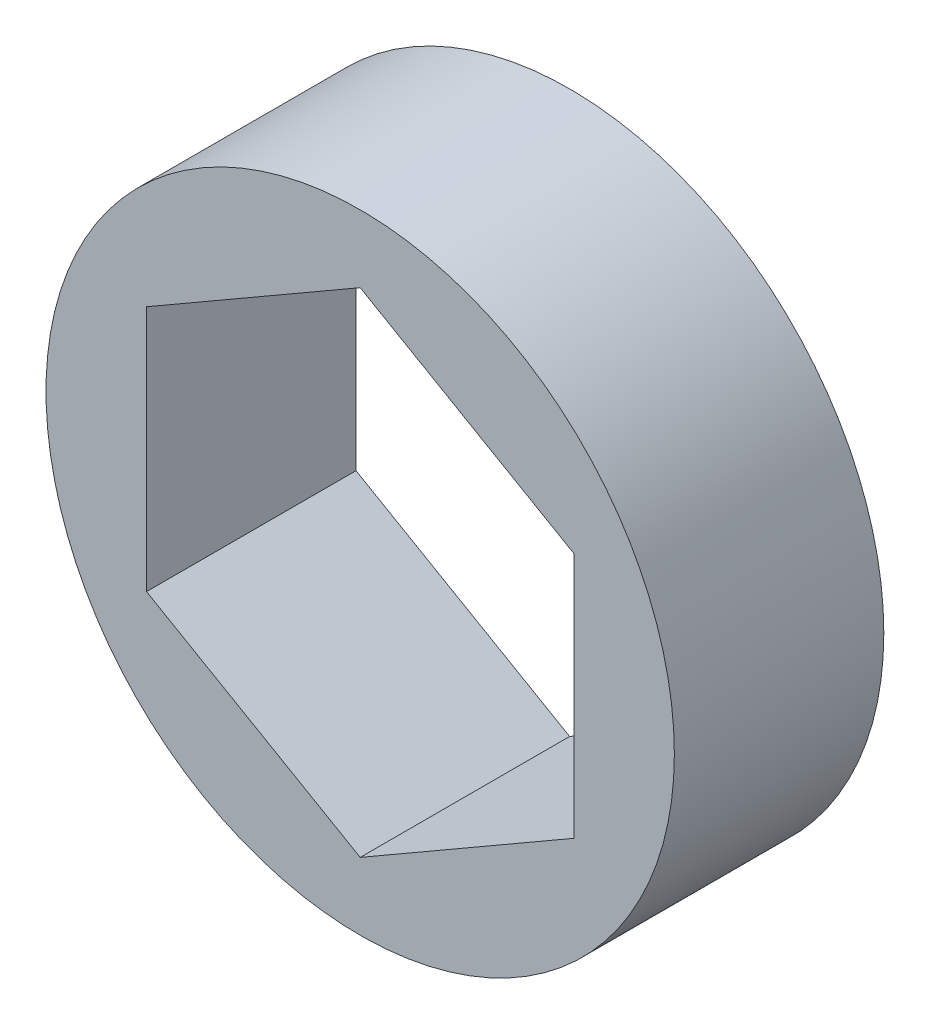
ISO-10303-21;
HEADER;
FILE_DESCRIPTION(('STEP AP214'),'2;1');
FILE_NAME('part.step','',(''),(''),'','','');
FILE_SCHEMA(('AUTOMOTIVE_DESIGN { 1 0 10303 214 1 1 1 1 }'));
ENDSEC;
DATA;
#1=APPLICATION_CONTEXT('core data for automotive mechanical design processes');
#2=APPLICATION_PROTOCOL_DEFINITION('international standard','automotive_design',2000,#1);
#3=PRODUCT_CONTEXT('',#1,'mechanical');
#4=PRODUCT('Part','Part','',(#3));
#5=PRODUCT_RELATED_PRODUCT_CATEGORY('part','',(#4));
#6=PRODUCT_DEFINITION_FORMATION('','',#4);
#7=PRODUCT_DEFINITION_CONTEXT('part definition',#1,'design');
#8=PRODUCT_DEFINITION('design','',#6,#7);
#9=PRODUCT_DEFINITION_SHAPE('','',#8);
#10=(LENGTH_UNIT() NAMED_UNIT(*) SI_UNIT(.MILLI.,.METRE.));
#11=(NAMED_UNIT(*) PLANE_ANGLE_UNIT() SI_UNIT($,.RADIAN.));
#12=(NAMED_UNIT(*) SI_UNIT($,.STERADIAN.) SOLID_ANGLE_UNIT());
#13=UNCERTAINTY_MEASURE_WITH_UNIT(LENGTH_MEASURE(1.E-05),#10,'distance_accuracy_value','');
#14=(GEOMETRIC_REPRESENTATION_CONTEXT(3) GLOBAL_UNCERTAINTY_ASSIGNED_CONTEXT((#13)) GLOBAL_UNIT_ASSIGNED_CONTEXT((#10,
#11,#12)) REPRESENTATION_CONTEXT('',''));
#15=CARTESIAN_POINT('',(0.,0.,0.));
#16=DIRECTION('',(0.,0.,1.));
#17=DIRECTION('',(1.,0.,0.));
#18=AXIS2_PLACEMENT_3D('',#15,#16,#17);
#19=CARTESIAN_POINT('',(0.,0.,3.175));
#20=DIRECTION('',(0.,0.,1.));
#21=DIRECTION('',(1.,0.,0.));
#22=AXIS2_PLACEMENT_3D('',#19,#20,#21);
#23=PLANE('',#22);
#24=CARTESIAN_POINT('',(0.,0.,3.175));
#25=DIRECTION('',(0.,0.,1.));
#26=DIRECTION('',(1.,0.,0.));
#27=AXIS2_PLACEMENT_3D('',#24,#25,#26);
#28=CIRCLE('',#27,9.525);
#29=CARTESIAN_POINT('',(9.525,0.,3.175));
#30=VERTEX_POINT('',#29);
#31=EDGE_CURVE('E11',#30,#30,#28,.T.);
#32=ORIENTED_EDGE('',*,*,#31,.T.);
#33=EDGE_LOOP('',(#32));
#34=FACE_BOUND('',#33,.T.);
#35=DIRECTION('',(-0.866025403784439,-0.5,0.));
#36=VECTOR('',#35,1.);
#37=CARTESIAN_POINT('',(0.,7.47899538708241,3.175));
#38=LINE('',#37,#36);
#39=CARTESIAN_POINT('',(0.,7.47899538708241,3.175));
#40=VERTEX_POINT('',#39);
#41=CARTESIAN_POINT('',(-6.477,3.73949769354121,3.175));
#42=VERTEX_POINT('',#41);
#43=EDGE_CURVE('E108',#40,#42,#38,.T.);
#44=ORIENTED_EDGE('',*,*,#43,.F.);
#45=DIRECTION('',(-0.866025403784439,0.5,0.));
#46=VECTOR('',#45,1.);
#47=CARTESIAN_POINT('',(6.477,3.73949769354121,3.175));
#48=LINE('',#47,#46);
#49=CARTESIAN_POINT('',(6.477,3.73949769354121,3.175));
#50=VERTEX_POINT('',#49);
#51=EDGE_CURVE('E99',#50,#40,#48,.T.);
#52=ORIENTED_EDGE('',*,*,#51,.F.);
#53=DIRECTION('',(0.,1.,0.));
#54=VECTOR('',#53,1.);
#55=CARTESIAN_POINT('',(6.477,-3.73949769354121,3.175));
#56=LINE('',#55,#54);
#57=CARTESIAN_POINT('',(6.477,-3.73949769354121,3.175));
#58=VERTEX_POINT('',#57);
#59=EDGE_CURVE('E133',#58,#50,#56,.T.);
#60=ORIENTED_EDGE('',*,*,#59,.F.);
#61=DIRECTION('',(0.866025403784439,0.5,0.));
#62=VECTOR('',#61,1.);
#63=CARTESIAN_POINT('',(0.,-7.47899538708241,3.175));
#64=LINE('',#63,#62);
#65=CARTESIAN_POINT('',(0.,-7.47899538708241,3.175));
#66=VERTEX_POINT('',#65);
#67=EDGE_CURVE('E130',#66,#58,#64,.T.);
#68=ORIENTED_EDGE('',*,*,#67,.F.);
#69=DIRECTION('',(0.866025403784439,-0.5,0.));
#70=VECTOR('',#69,1.);
#71=CARTESIAN_POINT('',(-6.477,-3.73949769354121,3.175));
#72=LINE('',#71,#70);
#73=CARTESIAN_POINT('',(-6.477,-3.73949769354121,3.175));
#74=VERTEX_POINT('',#73);
#75=EDGE_CURVE('E125',#74,#66,#72,.T.);
#76=ORIENTED_EDGE('',*,*,#75,.F.);
#77=DIRECTION('',(0.,-1.,0.));
#78=VECTOR('',#77,1.);
#79=CARTESIAN_POINT('',(-6.477,3.73949769354121,3.175));
#80=LINE('',#79,#78);
#81=EDGE_CURVE('E121',#42,#74,#80,.T.);
#82=ORIENTED_EDGE('',*,*,#81,.F.);
#83=EDGE_LOOP('',(#44,#52,#60,#68,#76,#82));
#84=FACE_BOUND('',#83,.T.);
#85=ADVANCED_FACE('F45',(#34,#84),#23,.T.);
#86=CARTESIAN_POINT('',(0.,0.,-3.175));
#87=DIRECTION('',(0.,0.,1.));
#88=DIRECTION('',(1.,0.,0.));
#89=AXIS2_PLACEMENT_3D('',#86,#87,#88);
#90=PLANE('',#89);
#91=CARTESIAN_POINT('',(0.,0.,-3.175));
#92=DIRECTION('',(0.,0.,1.));
#93=DIRECTION('',(1.,0.,0.));
#94=AXIS2_PLACEMENT_3D('',#91,#92,#93);
#95=CIRCLE('',#94,9.525);
#96=CARTESIAN_POINT('',(9.525,0.,-3.175));
#97=VERTEX_POINT('',#96);
#98=EDGE_CURVE('E49',#97,#97,#95,.T.);
#99=ORIENTED_EDGE('',*,*,#98,.F.);
#100=EDGE_LOOP('',(#99));
#101=FACE_BOUND('',#100,.T.);
#102=DIRECTION('',(-0.866025403784439,0.5,0.));
#103=VECTOR('',#102,1.);
#104=CARTESIAN_POINT('',(6.477,3.73949769354121,-3.175));
#105=LINE('',#104,#103);
#106=CARTESIAN_POINT('',(6.477,3.73949769354121,-3.175));
#107=VERTEX_POINT('',#106);
#108=CARTESIAN_POINT('',(0.,7.47899538708241,-3.175));
#109=VERTEX_POINT('',#108);
#110=EDGE_CURVE('E69',#107,#109,#105,.T.);
#111=ORIENTED_EDGE('',*,*,#110,.T.);
#112=DIRECTION('',(-0.866025403784439,-0.5,0.));
#113=VECTOR('',#112,1.);
#114=CARTESIAN_POINT('',(0.,7.47899538708241,-3.175));
#115=LINE('',#114,#113);
#116=CARTESIAN_POINT('',(-6.477,3.73949769354121,-3.175));
#117=VERTEX_POINT('',#116);
#118=EDGE_CURVE('E115',#109,#117,#115,.T.);
#119=ORIENTED_EDGE('',*,*,#118,.T.);
#120=DIRECTION('',(0.,-1.,0.));
#121=VECTOR('',#120,1.);
#122=CARTESIAN_POINT('',(-6.477,3.73949769354121,-3.175));
#123=LINE('',#122,#121);
#124=CARTESIAN_POINT('',(-6.477,-3.73949769354121,-3.175));
#125=VERTEX_POINT('',#124);
#126=EDGE_CURVE('E140',#117,#125,#123,.T.);
#127=ORIENTED_EDGE('',*,*,#126,.T.);
#128=DIRECTION('',(0.866025403784439,-0.5,0.));
#129=VECTOR('',#128,1.);
#130=CARTESIAN_POINT('',(-6.477,-3.73949769354121,-3.175));
#131=LINE('',#130,#129);
#132=CARTESIAN_POINT('',(0.,-7.47899538708241,-3.175));
#133=VERTEX_POINT('',#132);
#134=EDGE_CURVE('E144',#125,#133,#131,.T.);
#135=ORIENTED_EDGE('',*,*,#134,.T.);
#136=DIRECTION('',(0.866025403784439,0.5,0.));
#137=VECTOR('',#136,1.);
#138=CARTESIAN_POINT('',(0.,-7.47899538708241,-3.175));
#139=LINE('',#138,#137);
#140=CARTESIAN_POINT('',(6.477,-3.73949769354121,-3.175));
#141=VERTEX_POINT('',#140);
#142=EDGE_CURVE('E148',#133,#141,#139,.T.);
#143=ORIENTED_EDGE('',*,*,#142,.T.);
#144=DIRECTION('',(0.,1.,0.));
#145=VECTOR('',#144,1.);
#146=CARTESIAN_POINT('',(6.477,-3.73949769354121,-3.175));
#147=LINE('',#146,#145);
#148=EDGE_CURVE('E109',#141,#107,#147,.T.);
#149=ORIENTED_EDGE('',*,*,#148,.T.);
#150=EDGE_LOOP('',(#111,#119,#127,#135,#143,#149));
#151=FACE_BOUND('',#150,.T.);
#152=ADVANCED_FACE('F172',(#101,#151),#90,.F.);
#153=CARTESIAN_POINT('',(0.,0.,3.175));
#154=DIRECTION('',(0.,0.,-1.));
#155=DIRECTION('',(-1.,0.,0.));
#156=AXIS2_PLACEMENT_3D('',#153,#154,#155);
#157=CYLINDRICAL_SURFACE('',#156,9.525);
#158=ORIENTED_EDGE('',*,*,#31,.F.);
#159=EDGE_LOOP('',(#158));
#160=FACE_BOUND('',#159,.T.);
#161=ORIENTED_EDGE('',*,*,#98,.T.);
#162=EDGE_LOOP('',(#161));
#163=FACE_BOUND('',#162,.T.);
#164=ADVANCED_FACE('F47',(#160,#163),#157,.T.);
#165=CARTESIAN_POINT('',(6.477,3.73949769354121,3.175));
#166=DIRECTION('',(-0.5,-0.866025403784439,0.));
#167=DIRECTION('',(0.866025403784439,-0.5,0.));
#168=AXIS2_PLACEMENT_3D('',#165,#166,#167);
#169=PLANE('',#168);
#170=ORIENTED_EDGE('',*,*,#110,.F.);
#171=DIRECTION('',(0.,0.,-1.));
#172=VECTOR('',#171,1.);
#173=CARTESIAN_POINT('',(6.477,3.73949769354121,3.175));
#174=LINE('',#173,#172);
#175=EDGE_CURVE('E103',#50,#107,#174,.T.);
#176=ORIENTED_EDGE('',*,*,#175,.F.);
#177=ORIENTED_EDGE('',*,*,#51,.T.);
#178=DIRECTION('',(0.,0.,-1.));
#179=VECTOR('',#178,1.);
#180=CARTESIAN_POINT('',(0.,7.47899538708241,3.175));
#181=LINE('',#180,#179);
#182=EDGE_CURVE('E102',#40,#109,#181,.T.);
#183=ORIENTED_EDGE('',*,*,#182,.T.);
#184=EDGE_LOOP('',(#170,#176,#177,#183));
#185=FACE_BOUND('',#184,.T.);
#186=ADVANCED_FACE('F101',(#185),#169,.T.);
#187=CARTESIAN_POINT('',(0.,7.47899538708241,3.175));
#188=DIRECTION('',(0.5,-0.866025403784439,0.));
#189=DIRECTION('',(0.866025403784439,0.5,0.));
#190=AXIS2_PLACEMENT_3D('',#187,#188,#189);
#191=PLANE('',#190);
#192=ORIENTED_EDGE('',*,*,#118,.F.);
#193=ORIENTED_EDGE('',*,*,#182,.F.);
#194=ORIENTED_EDGE('',*,*,#43,.T.);
#195=DIRECTION('',(0.,0.,-1.));
#196=VECTOR('',#195,1.);
#197=CARTESIAN_POINT('',(-6.477,3.73949769354121,3.175));
#198=LINE('',#197,#196);
#199=EDGE_CURVE('E117',#42,#117,#198,.T.);
#200=ORIENTED_EDGE('',*,*,#199,.T.);
#201=EDGE_LOOP('',(#192,#193,#194,#200));
#202=FACE_BOUND('',#201,.T.);
#203=ADVANCED_FACE('F112',(#202),#191,.T.);
#204=CARTESIAN_POINT('',(-6.477,3.73949769354121,3.175));
#205=DIRECTION('',(1.,0.,0.));
#206=DIRECTION('',(0.,1.,0.));
#207=AXIS2_PLACEMENT_3D('',#204,#205,#206);
#208=PLANE('',#207);
#209=ORIENTED_EDGE('',*,*,#126,.F.);
#210=ORIENTED_EDGE('',*,*,#199,.F.);
#211=ORIENTED_EDGE('',*,*,#81,.T.);
#212=DIRECTION('',(0.,0.,-1.));
#213=VECTOR('',#212,1.);
#214=CARTESIAN_POINT('',(-6.477,-3.73949769354121,3.175));
#215=LINE('',#214,#213);
#216=EDGE_CURVE('E162',#74,#125,#215,.T.);
#217=ORIENTED_EDGE('',*,*,#216,.T.);
#218=EDGE_LOOP('',(#209,#210,#211,#217));
#219=FACE_BOUND('',#218,.T.);
#220=ADVANCED_FACE('F168',(#219),#208,.T.);
#221=CARTESIAN_POINT('',(-6.477,-3.73949769354121,3.175));
#222=DIRECTION('',(0.5,0.866025403784439,0.));
#223=DIRECTION('',(-0.866025403784439,0.5,0.));
#224=AXIS2_PLACEMENT_3D('',#221,#222,#223);
#225=PLANE('',#224);
#226=ORIENTED_EDGE('',*,*,#134,.F.);
#227=ORIENTED_EDGE('',*,*,#216,.F.);
#228=ORIENTED_EDGE('',*,*,#75,.T.);
#229=DIRECTION('',(0.,0.,-1.));
#230=VECTOR('',#229,1.);
#231=CARTESIAN_POINT('',(0.,-7.47899538708241,3.175));
#232=LINE('',#231,#230);
#233=EDGE_CURVE('E159',#66,#133,#232,.T.);
#234=ORIENTED_EDGE('',*,*,#233,.T.);
#235=EDGE_LOOP('',(#226,#227,#228,#234));
#236=FACE_BOUND('',#235,.T.);
#237=ADVANCED_FACE('F180',(#236),#225,.T.);
#238=CARTESIAN_POINT('',(0.,-7.47899538708241,3.175));
#239=DIRECTION('',(-0.5,0.866025403784439,0.));
#240=DIRECTION('',(-0.866025403784439,-0.5,0.));
#241=AXIS2_PLACEMENT_3D('',#238,#239,#240);
#242=PLANE('',#241);
#243=ORIENTED_EDGE('',*,*,#142,.F.);
#244=ORIENTED_EDGE('',*,*,#233,.F.);
#245=ORIENTED_EDGE('',*,*,#67,.T.);
#246=DIRECTION('',(0.,0.,-1.));
#247=VECTOR('',#246,1.);
#248=CARTESIAN_POINT('',(6.477,-3.73949769354121,3.175));
#249=LINE('',#248,#247);
#250=EDGE_CURVE('E61',#58,#141,#249,.T.);
#251=ORIENTED_EDGE('',*,*,#250,.T.);
#252=EDGE_LOOP('',(#243,#244,#245,#251));
#253=FACE_BOUND('',#252,.T.);
#254=ADVANCED_FACE('F178',(#253),#242,.T.);
#255=CARTESIAN_POINT('',(6.477,-3.73949769354121,3.175));
#256=DIRECTION('',(-1.,0.,0.));
#257=DIRECTION('',(0.,0.,1.));
#258=AXIS2_PLACEMENT_3D('',#255,#256,#257);
#259=PLANE('',#258);
#260=ORIENTED_EDGE('',*,*,#148,.F.);
#261=ORIENTED_EDGE('',*,*,#250,.F.);
#262=ORIENTED_EDGE('',*,*,#59,.T.);
#263=ORIENTED_EDGE('',*,*,#175,.T.);
#264=EDGE_LOOP('',(#260,#261,#262,#263));
#265=FACE_BOUND('',#264,.T.);
#266=ADVANCED_FACE('F174',(#265),#259,.T.);
#267=CLOSED_SHELL('',(#85,#152,#164,#186,#203,#220,#237,#254,#266));
#268=MANIFOLD_SOLID_BREP('B2',#267);
#269=ADVANCED_BREP_SHAPE_REPRESENTATION('',(#18,#268),#14);
#270=SHAPE_DEFINITION_REPRESENTATION(#9,#269);
ENDSEC;
END-ISO-10303-21;
